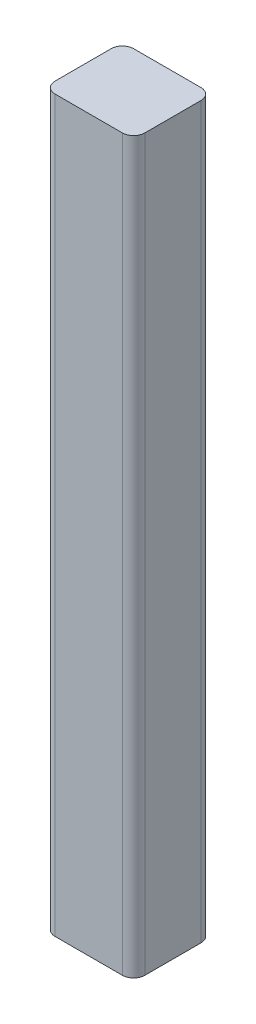
ISO-10303-21;
HEADER;
FILE_DESCRIPTION(('STEP AP214'),'2;1');
FILE_NAME('part.step','',(''),(''),'','','');
FILE_SCHEMA(('AUTOMOTIVE_DESIGN { 1 0 10303 214 1 1 1 1 }'));
ENDSEC;
DATA;
#1=APPLICATION_CONTEXT('core data for automotive mechanical design processes');
#2=APPLICATION_PROTOCOL_DEFINITION('international standard','automotive_design',2000,#1);
#3=PRODUCT_CONTEXT('',#1,'mechanical');
#4=PRODUCT('Part','Part','',(#3));
#5=PRODUCT_RELATED_PRODUCT_CATEGORY('part','',(#4));
#6=PRODUCT_DEFINITION_FORMATION('','',#4);
#7=PRODUCT_DEFINITION_CONTEXT('part definition',#1,'design');
#8=PRODUCT_DEFINITION('design','',#6,#7);
#9=PRODUCT_DEFINITION_SHAPE('','',#8);
#10=(LENGTH_UNIT() NAMED_UNIT(*) SI_UNIT(.MILLI.,.METRE.));
#11=(NAMED_UNIT(*) PLANE_ANGLE_UNIT() SI_UNIT($,.RADIAN.));
#12=(NAMED_UNIT(*) SI_UNIT($,.STERADIAN.) SOLID_ANGLE_UNIT());
#13=UNCERTAINTY_MEASURE_WITH_UNIT(LENGTH_MEASURE(1.E-05),#10,'distance_accuracy_value','');
#14=(GEOMETRIC_REPRESENTATION_CONTEXT(3) GLOBAL_UNCERTAINTY_ASSIGNED_CONTEXT((#13)) GLOBAL_UNIT_ASSIGNED_CONTEXT((#10,
#11,#12)) REPRESENTATION_CONTEXT('',''));
#15=CARTESIAN_POINT('',(0.,0.,0.));
#16=DIRECTION('',(0.,0.,1.));
#17=DIRECTION('',(1.,0.,0.));
#18=AXIS2_PLACEMENT_3D('',#15,#16,#17);
#19=CARTESIAN_POINT('',(4.,65.,3.5));
#20=DIRECTION('',(-1.,0.,0.));
#21=DIRECTION('',(0.,0.,1.));
#22=AXIS2_PLACEMENT_3D('',#19,#20,#21);
#23=PLANE('',#22);
#24=DIRECTION('',(0.,0.,-1.));
#25=VECTOR('',#24,1.);
#26=CARTESIAN_POINT('',(4.,0.,3.5));
#27=LINE('',#26,#25);
#28=CARTESIAN_POINT('',(4.,0.,2.5));
#29=VERTEX_POINT('',#28);
#30=CARTESIAN_POINT('',(4.,0.,-2.5));
#31=VERTEX_POINT('',#30);
#32=EDGE_CURVE('E160',#29,#31,#27,.T.);
#33=ORIENTED_EDGE('',*,*,#32,.T.);
#34=DIRECTION('',(0.,-1.,0.));
#35=VECTOR('',#34,1.);
#36=CARTESIAN_POINT('',(4.,65.,-2.5));
#37=LINE('',#36,#35);
#38=CARTESIAN_POINT('',(4.,65.,-2.5));
#39=VERTEX_POINT('',#38);
#40=EDGE_CURVE('E11',#31,#39,#37,.F.);
#41=ORIENTED_EDGE('',*,*,#40,.T.);
#42=DIRECTION('',(0.,0.,-1.));
#43=VECTOR('',#42,1.);
#44=CARTESIAN_POINT('',(4.,65.,3.5));
#45=LINE('',#44,#43);
#46=CARTESIAN_POINT('',(4.,65.,2.5));
#47=VERTEX_POINT('',#46);
#48=EDGE_CURVE('E128',#47,#39,#45,.T.);
#49=ORIENTED_EDGE('',*,*,#48,.F.);
#50=DIRECTION('',(0.,-1.,0.));
#51=VECTOR('',#50,1.);
#52=CARTESIAN_POINT('',(4.,65.,2.5));
#53=LINE('',#52,#51);
#54=EDGE_CURVE('E44',#47,#29,#53,.T.);
#55=ORIENTED_EDGE('',*,*,#54,.T.);
#56=EDGE_LOOP('',(#33,#41,#49,#55));
#57=FACE_BOUND('',#56,.T.);
#58=ADVANCED_FACE('F36',(#57),#23,.F.);
#59=CARTESIAN_POINT('',(-4.,65.,-3.5));
#60=DIRECTION('',(0.,0.,1.));
#61=DIRECTION('',(1.,0.,0.));
#62=AXIS2_PLACEMENT_3D('',#59,#60,#61);
#63=PLANE('',#62);
#64=DIRECTION('',(-1.,0.,0.));
#65=VECTOR('',#64,1.);
#66=CARTESIAN_POINT('',(-4.,0.,-3.5));
#67=LINE('',#66,#65);
#68=CARTESIAN_POINT('',(3.,0.,-3.5));
#69=VERTEX_POINT('',#68);
#70=CARTESIAN_POINT('',(-3.,0.,-3.5));
#71=VERTEX_POINT('',#70);
#72=EDGE_CURVE('E133',#69,#71,#67,.T.);
#73=ORIENTED_EDGE('',*,*,#72,.T.);
#74=DIRECTION('',(0.,-1.,0.));
#75=VECTOR('',#74,1.);
#76=CARTESIAN_POINT('',(-3.,65.,-3.5));
#77=LINE('',#76,#75);
#78=CARTESIAN_POINT('',(-3.,65.,-3.5));
#79=VERTEX_POINT('',#78);
#80=EDGE_CURVE('E51',#71,#79,#77,.F.);
#81=ORIENTED_EDGE('',*,*,#80,.T.);
#82=DIRECTION('',(-1.,0.,0.));
#83=VECTOR('',#82,1.);
#84=CARTESIAN_POINT('',(-4.,65.,-3.5));
#85=LINE('',#84,#83);
#86=CARTESIAN_POINT('',(3.,65.,-3.5));
#87=VERTEX_POINT('',#86);
#88=EDGE_CURVE('E131',#87,#79,#85,.T.);
#89=ORIENTED_EDGE('',*,*,#88,.F.);
#90=DIRECTION('',(0.,-1.,0.));
#91=VECTOR('',#90,1.);
#92=CARTESIAN_POINT('',(3.,65.,-3.5));
#93=LINE('',#92,#91);
#94=EDGE_CURVE('E152',#87,#69,#93,.T.);
#95=ORIENTED_EDGE('',*,*,#94,.T.);
#96=EDGE_LOOP('',(#73,#81,#89,#95));
#97=FACE_BOUND('',#96,.T.);
#98=ADVANCED_FACE('F180',(#97),#63,.F.);
#99=CARTESIAN_POINT('',(-4.,65.,3.5));
#100=DIRECTION('',(1.,0.,0.));
#101=DIRECTION('',(0.,0.,-1.));
#102=AXIS2_PLACEMENT_3D('',#99,#100,#101);
#103=PLANE('',#102);
#104=DIRECTION('',(0.,0.,1.));
#105=VECTOR('',#104,1.);
#106=CARTESIAN_POINT('',(-4.,0.,3.5));
#107=LINE('',#106,#105);
#108=CARTESIAN_POINT('',(-4.,0.,-2.5));
#109=VERTEX_POINT('',#108);
#110=CARTESIAN_POINT('',(-4.,0.,2.5));
#111=VERTEX_POINT('',#110);
#112=EDGE_CURVE('E129',#109,#111,#107,.T.);
#113=ORIENTED_EDGE('',*,*,#112,.T.);
#114=DIRECTION('',(0.,-1.,0.));
#115=VECTOR('',#114,1.);
#116=CARTESIAN_POINT('',(-4.,65.,2.5));
#117=LINE('',#116,#115);
#118=CARTESIAN_POINT('',(-4.,65.,2.5));
#119=VERTEX_POINT('',#118);
#120=EDGE_CURVE('E107',#111,#119,#117,.F.);
#121=ORIENTED_EDGE('',*,*,#120,.T.);
#122=DIRECTION('',(0.,0.,1.));
#123=VECTOR('',#122,1.);
#124=CARTESIAN_POINT('',(-4.,65.,3.5));
#125=LINE('',#124,#123);
#126=CARTESIAN_POINT('',(-4.,65.,-2.5));
#127=VERTEX_POINT('',#126);
#128=EDGE_CURVE('E168',#127,#119,#125,.T.);
#129=ORIENTED_EDGE('',*,*,#128,.F.);
#130=DIRECTION('',(0.,-1.,0.));
#131=VECTOR('',#130,1.);
#132=CARTESIAN_POINT('',(-4.,65.,-2.5));
#133=LINE('',#132,#131);
#134=EDGE_CURVE('E112',#127,#109,#133,.T.);
#135=ORIENTED_EDGE('',*,*,#134,.T.);
#136=EDGE_LOOP('',(#113,#121,#129,#135));
#137=FACE_BOUND('',#136,.T.);
#138=ADVANCED_FACE('F179',(#137),#103,.F.);
#139=CARTESIAN_POINT('',(-4.,65.,3.5));
#140=DIRECTION('',(0.,0.,-1.));
#141=DIRECTION('',(-1.,0.,0.));
#142=AXIS2_PLACEMENT_3D('',#139,#140,#141);
#143=PLANE('',#142);
#144=DIRECTION('',(1.,0.,0.));
#145=VECTOR('',#144,1.);
#146=CARTESIAN_POINT('',(-4.,65.,3.5));
#147=LINE('',#146,#145);
#148=CARTESIAN_POINT('',(-3.,65.,3.5));
#149=VERTEX_POINT('',#148);
#150=CARTESIAN_POINT('',(3.,65.,3.5));
#151=VERTEX_POINT('',#150);
#152=EDGE_CURVE('E122',#149,#151,#147,.T.);
#153=ORIENTED_EDGE('',*,*,#152,.F.);
#154=DIRECTION('',(0.,-1.,0.));
#155=VECTOR('',#154,1.);
#156=CARTESIAN_POINT('',(-3.,65.,3.5));
#157=LINE('',#156,#155);
#158=CARTESIAN_POINT('',(-3.,0.,3.5));
#159=VERTEX_POINT('',#158);
#160=EDGE_CURVE('E106',#149,#159,#157,.T.);
#161=ORIENTED_EDGE('',*,*,#160,.T.);
#162=DIRECTION('',(1.,0.,0.));
#163=VECTOR('',#162,1.);
#164=CARTESIAN_POINT('',(-4.,0.,3.5));
#165=LINE('',#164,#163);
#166=CARTESIAN_POINT('',(3.,0.,3.5));
#167=VERTEX_POINT('',#166);
#168=EDGE_CURVE('E119',#159,#167,#165,.T.);
#169=ORIENTED_EDGE('',*,*,#168,.T.);
#170=DIRECTION('',(0.,-1.,0.));
#171=VECTOR('',#170,1.);
#172=CARTESIAN_POINT('',(3.,65.,3.5));
#173=LINE('',#172,#171);
#174=EDGE_CURVE('E124',#167,#151,#173,.F.);
#175=ORIENTED_EDGE('',*,*,#174,.T.);
#176=EDGE_LOOP('',(#153,#161,#169,#175));
#177=FACE_BOUND('',#176,.T.);
#178=ADVANCED_FACE('F118',(#177),#143,.F.);
#179=CARTESIAN_POINT('',(0.,65.,0.));
#180=DIRECTION('',(0.,-1.,0.));
#181=DIRECTION('',(0.,0.,-1.));
#182=AXIS2_PLACEMENT_3D('',#179,#180,#181);
#183=PLANE('',#182);
#184=ORIENTED_EDGE('',*,*,#128,.T.);
#185=CARTESIAN_POINT('',(-3.,65.,2.5));
#186=DIRECTION('',(0.,-1.,0.));
#187=DIRECTION('',(0.,0.,-1.));
#188=AXIS2_PLACEMENT_3D('',#185,#186,#187);
#189=CIRCLE('',#188,1.);
#190=EDGE_CURVE('E150',#119,#149,#189,.F.);
#191=ORIENTED_EDGE('',*,*,#190,.T.);
#192=ORIENTED_EDGE('',*,*,#152,.T.);
#193=CARTESIAN_POINT('',(3.,65.,2.5));
#194=DIRECTION('',(0.,-1.,0.));
#195=DIRECTION('',(0.,0.,-1.));
#196=AXIS2_PLACEMENT_3D('',#193,#194,#195);
#197=CIRCLE('',#196,1.);
#198=EDGE_CURVE('E145',#151,#47,#197,.F.);
#199=ORIENTED_EDGE('',*,*,#198,.T.);
#200=ORIENTED_EDGE('',*,*,#48,.T.);
#201=CARTESIAN_POINT('',(3.,65.,-2.5));
#202=DIRECTION('',(0.,-1.,0.));
#203=DIRECTION('',(0.,0.,-1.));
#204=AXIS2_PLACEMENT_3D('',#201,#202,#203);
#205=CIRCLE('',#204,1.);
#206=EDGE_CURVE('E58',#39,#87,#205,.F.);
#207=ORIENTED_EDGE('',*,*,#206,.T.);
#208=ORIENTED_EDGE('',*,*,#88,.T.);
#209=CARTESIAN_POINT('',(-3.,65.,-2.5));
#210=DIRECTION('',(0.,-1.,0.));
#211=DIRECTION('',(0.,0.,-1.));
#212=AXIS2_PLACEMENT_3D('',#209,#210,#211);
#213=CIRCLE('',#212,1.);
#214=EDGE_CURVE('E148',#79,#127,#213,.F.);
#215=ORIENTED_EDGE('',*,*,#214,.T.);
#216=EDGE_LOOP('',(#184,#191,#192,#199,#200,#207,#208,#215));
#217=FACE_BOUND('',#216,.T.);
#218=ADVANCED_FACE('F172',(#217),#183,.F.);
#219=CARTESIAN_POINT('',(0.,0.,0.));
#220=DIRECTION('',(0.,-1.,0.));
#221=DIRECTION('',(0.,0.,-1.));
#222=AXIS2_PLACEMENT_3D('',#219,#220,#221);
#223=PLANE('',#222);
#224=ORIENTED_EDGE('',*,*,#168,.F.);
#225=CARTESIAN_POINT('',(-3.,0.,2.5));
#226=DIRECTION('',(0.,-1.,0.));
#227=DIRECTION('',(0.,0.,-1.));
#228=AXIS2_PLACEMENT_3D('',#225,#226,#227);
#229=CIRCLE('',#228,1.);
#230=EDGE_CURVE('E102',#159,#111,#229,.T.);
#231=ORIENTED_EDGE('',*,*,#230,.T.);
#232=ORIENTED_EDGE('',*,*,#112,.F.);
#233=CARTESIAN_POINT('',(-3.,0.,-2.5));
#234=DIRECTION('',(0.,-1.,0.));
#235=DIRECTION('',(0.,0.,-1.));
#236=AXIS2_PLACEMENT_3D('',#233,#234,#235);
#237=CIRCLE('',#236,1.);
#238=EDGE_CURVE('E113',#109,#71,#237,.T.);
#239=ORIENTED_EDGE('',*,*,#238,.T.);
#240=ORIENTED_EDGE('',*,*,#72,.F.);
#241=CARTESIAN_POINT('',(3.,0.,-2.5));
#242=DIRECTION('',(0.,-1.,0.));
#243=DIRECTION('',(0.,0.,-1.));
#244=AXIS2_PLACEMENT_3D('',#241,#242,#243);
#245=CIRCLE('',#244,1.);
#246=EDGE_CURVE('E139',#69,#31,#245,.T.);
#247=ORIENTED_EDGE('',*,*,#246,.T.);
#248=ORIENTED_EDGE('',*,*,#32,.F.);
#249=CARTESIAN_POINT('',(3.,0.,2.5));
#250=DIRECTION('',(0.,-1.,0.));
#251=DIRECTION('',(0.,0.,-1.));
#252=AXIS2_PLACEMENT_3D('',#249,#250,#251);
#253=CIRCLE('',#252,1.);
#254=EDGE_CURVE('E123',#29,#167,#253,.T.);
#255=ORIENTED_EDGE('',*,*,#254,.T.);
#256=EDGE_LOOP('',(#224,#231,#232,#239,#240,#247,#248,#255));
#257=FACE_BOUND('',#256,.T.);
#258=ADVANCED_FACE('F126',(#257),#223,.T.);
#259=CARTESIAN_POINT('',(-3.,65.,2.5));
#260=DIRECTION('',(0.,-1.,0.));
#261=DIRECTION('',(0.,0.,-1.));
#262=AXIS2_PLACEMENT_3D('',#259,#260,#261);
#263=CYLINDRICAL_SURFACE('',#262,1.);
#264=ORIENTED_EDGE('',*,*,#190,.F.);
#265=ORIENTED_EDGE('',*,*,#120,.F.);
#266=ORIENTED_EDGE('',*,*,#230,.F.);
#267=ORIENTED_EDGE('',*,*,#160,.F.);
#268=EDGE_LOOP('',(#264,#265,#266,#267));
#269=FACE_BOUND('',#268,.T.);
#270=ADVANCED_FACE('F105',(#269),#263,.T.);
#271=CARTESIAN_POINT('',(-3.,65.,-2.5));
#272=DIRECTION('',(0.,-1.,0.));
#273=DIRECTION('',(0.,0.,-1.));
#274=AXIS2_PLACEMENT_3D('',#271,#272,#273);
#275=CYLINDRICAL_SURFACE('',#274,1.);
#276=ORIENTED_EDGE('',*,*,#214,.F.);
#277=ORIENTED_EDGE('',*,*,#80,.F.);
#278=ORIENTED_EDGE('',*,*,#238,.F.);
#279=ORIENTED_EDGE('',*,*,#134,.F.);
#280=EDGE_LOOP('',(#276,#277,#278,#279));
#281=FACE_BOUND('',#280,.T.);
#282=ADVANCED_FACE('F177',(#281),#275,.T.);
#283=CARTESIAN_POINT('',(3.,65.,-2.5));
#284=DIRECTION('',(0.,-1.,0.));
#285=DIRECTION('',(0.,0.,-1.));
#286=AXIS2_PLACEMENT_3D('',#283,#284,#285);
#287=CYLINDRICAL_SURFACE('',#286,1.);
#288=ORIENTED_EDGE('',*,*,#206,.F.);
#289=ORIENTED_EDGE('',*,*,#40,.F.);
#290=ORIENTED_EDGE('',*,*,#246,.F.);
#291=ORIENTED_EDGE('',*,*,#94,.F.);
#292=EDGE_LOOP('',(#288,#289,#290,#291));
#293=FACE_BOUND('',#292,.T.);
#294=ADVANCED_FACE('F182',(#293),#287,.T.);
#295=CARTESIAN_POINT('',(3.,65.,2.5));
#296=DIRECTION('',(0.,-1.,0.));
#297=DIRECTION('',(0.,0.,-1.));
#298=AXIS2_PLACEMENT_3D('',#295,#296,#297);
#299=CYLINDRICAL_SURFACE('',#298,1.);
#300=ORIENTED_EDGE('',*,*,#198,.F.);
#301=ORIENTED_EDGE('',*,*,#174,.F.);
#302=ORIENTED_EDGE('',*,*,#254,.F.);
#303=ORIENTED_EDGE('',*,*,#54,.F.);
#304=EDGE_LOOP('',(#300,#301,#302,#303));
#305=FACE_BOUND('',#304,.T.);
#306=ADVANCED_FACE('F38',(#305),#299,.T.);
#307=CLOSED_SHELL('',(#58,#98,#138,#178,#218,#258,#270,#282,#294,#306));
#308=MANIFOLD_SOLID_BREP('B2',#307);
#309=ADVANCED_BREP_SHAPE_REPRESENTATION('',(#18,#308),#14);
#310=SHAPE_DEFINITION_REPRESENTATION(#9,#309);
ENDSEC;
END-ISO-10303-21;
